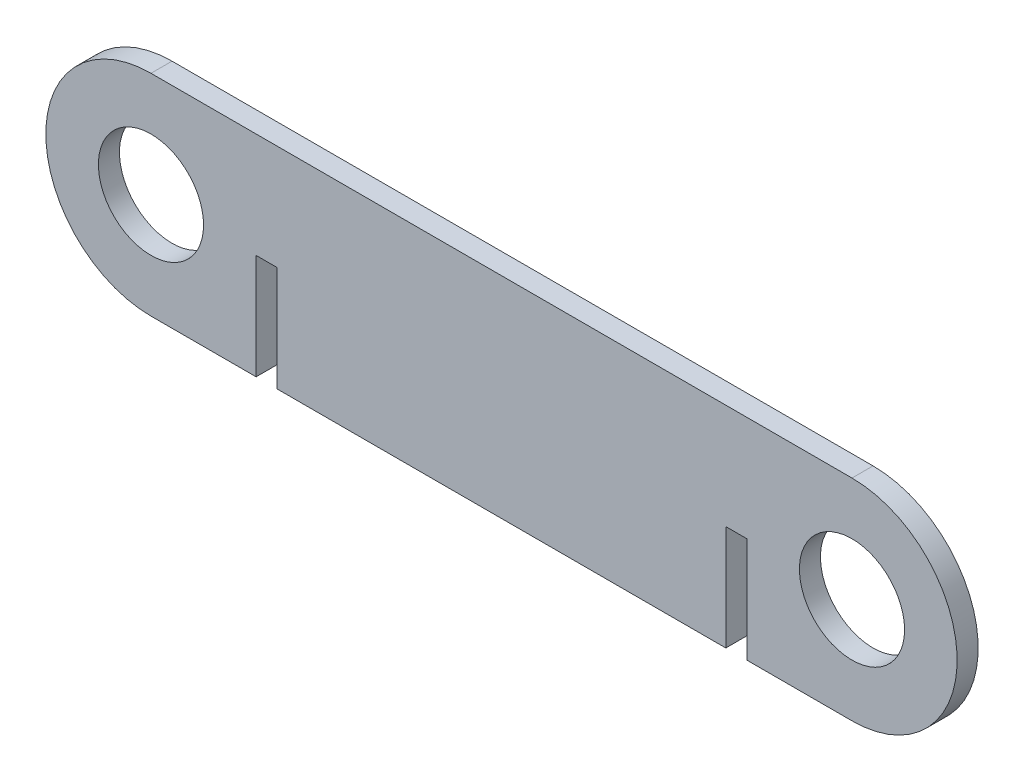
ISO-10303-21;
HEADER;
FILE_DESCRIPTION(('STEP AP214'),'2;1');
FILE_NAME('part.step','',(''),(''),'','','');
FILE_SCHEMA(('AUTOMOTIVE_DESIGN { 1 0 10303 214 1 1 1 1 }'));
ENDSEC;
DATA;
#1=APPLICATION_CONTEXT('core data for automotive mechanical design processes');
#2=APPLICATION_PROTOCOL_DEFINITION('international standard','automotive_design',2000,#1);
#3=PRODUCT_CONTEXT('',#1,'mechanical');
#4=PRODUCT('Part','Part','',(#3));
#5=PRODUCT_RELATED_PRODUCT_CATEGORY('part','',(#4));
#6=PRODUCT_DEFINITION_FORMATION('','',#4);
#7=PRODUCT_DEFINITION_CONTEXT('part definition',#1,'design');
#8=PRODUCT_DEFINITION('design','',#6,#7);
#9=PRODUCT_DEFINITION_SHAPE('','',#8);
#10=(LENGTH_UNIT() NAMED_UNIT(*) SI_UNIT(.MILLI.,.METRE.));
#11=(NAMED_UNIT(*) PLANE_ANGLE_UNIT() SI_UNIT($,.RADIAN.));
#12=(NAMED_UNIT(*) SI_UNIT($,.STERADIAN.) SOLID_ANGLE_UNIT());
#13=UNCERTAINTY_MEASURE_WITH_UNIT(LENGTH_MEASURE(1.E-05),#10,'distance_accuracy_value','');
#14=(GEOMETRIC_REPRESENTATION_CONTEXT(3) GLOBAL_UNCERTAINTY_ASSIGNED_CONTEXT((#13)) GLOBAL_UNIT_ASSIGNED_CONTEXT((#10,
#11,#12)) REPRESENTATION_CONTEXT('',''));
#15=CARTESIAN_POINT('',(0.,0.,0.));
#16=DIRECTION('',(0.,0.,1.));
#17=DIRECTION('',(1.,0.,0.));
#18=AXIS2_PLACEMENT_3D('',#15,#16,#17);
#19=CARTESIAN_POINT('',(10.4552456454755,-0.88545064021027,3.));
#20=DIRECTION('',(0.,1.,0.));
#21=DIRECTION('',(0.,0.,1.));
#22=AXIS2_PLACEMENT_3D('',#19,#20,#21);
#23=PLANE('',#22);
#24=DIRECTION('',(1.,0.,0.));
#25=VECTOR('',#24,1.);
#26=CARTESIAN_POINT('',(10.4552456454755,-0.88545064021027,0.));
#27=LINE('',#26,#25);
#28=CARTESIAN_POINT('',(28.4552456454755,-0.88545064021027,0.));
#29=VERTEX_POINT('',#28);
#30=CARTESIAN_POINT('',(92.4552456454755,-0.88545064021027,0.));
#31=VERTEX_POINT('',#30);
#32=EDGE_CURVE('E143',#29,#31,#27,.T.);
#33=ORIENTED_EDGE('',*,*,#32,.T.);
#34=DIRECTION('',(0.,0.,1.));
#35=VECTOR('',#34,1.);
#36=CARTESIAN_POINT('',(92.4552456454755,-0.88545064021027,0.));
#37=LINE('',#36,#35);
#38=CARTESIAN_POINT('',(92.4552456454755,-0.88545064021027,3.));
#39=VERTEX_POINT('',#38);
#40=EDGE_CURVE('E197',#31,#39,#37,.T.);
#41=ORIENTED_EDGE('',*,*,#40,.T.);
#42=DIRECTION('',(1.,0.,0.));
#43=VECTOR('',#42,1.);
#44=CARTESIAN_POINT('',(10.4552456454755,-0.88545064021027,3.));
#45=LINE('',#44,#43);
#46=CARTESIAN_POINT('',(28.4552456454755,-0.88545064021027,3.));
#47=VERTEX_POINT('',#46);
#48=EDGE_CURVE('E176',#47,#39,#45,.T.);
#49=ORIENTED_EDGE('',*,*,#48,.F.);
#50=DIRECTION('',(0.,0.,1.));
#51=VECTOR('',#50,1.);
#52=CARTESIAN_POINT('',(28.4552456454755,-0.88545064021027,0.));
#53=LINE('',#52,#51);
#54=EDGE_CURVE('E183',#29,#47,#53,.T.);
#55=ORIENTED_EDGE('',*,*,#54,.F.);
#56=EDGE_LOOP('',(#33,#41,#49,#55));
#57=FACE_BOUND('',#56,.T.);
#58=ADVANCED_FACE('F31',(#57),#23,.F.);
#59=CARTESIAN_POINT('',(10.4552456454755,-0.88545064021027,0.));
#60=VERTEX_POINT('',#59);
#61=CARTESIAN_POINT('',(25.4552456454755,-0.88545064021027,0.));
#62=VERTEX_POINT('',#61);
#63=EDGE_CURVE('E146',#60,#62,#27,.T.);
#64=ORIENTED_EDGE('',*,*,#63,.T.);
#65=DIRECTION('',(0.,0.,1.));
#66=VECTOR('',#65,1.);
#67=CARTESIAN_POINT('',(25.4552456454755,-0.88545064021027,0.));
#68=LINE('',#67,#66);
#69=CARTESIAN_POINT('',(25.4552456454755,-0.88545064021027,3.));
#70=VERTEX_POINT('',#69);
#71=EDGE_CURVE('E181',#62,#70,#68,.T.);
#72=ORIENTED_EDGE('',*,*,#71,.T.);
#73=CARTESIAN_POINT('',(10.4552456454755,-0.88545064021027,3.));
#74=VERTEX_POINT('',#73);
#75=EDGE_CURVE('E172',#74,#70,#45,.T.);
#76=ORIENTED_EDGE('',*,*,#75,.F.);
#77=DIRECTION('',(0.,0.,-1.));
#78=VECTOR('',#77,1.);
#79=CARTESIAN_POINT('',(10.4552456454755,-0.88545064021027,3.));
#80=LINE('',#79,#78);
#81=EDGE_CURVE('E11',#74,#60,#80,.T.);
#82=ORIENTED_EDGE('',*,*,#81,.T.);
#83=EDGE_LOOP('',(#64,#72,#76,#82));
#84=FACE_BOUND('',#83,.T.);
#85=ADVANCED_FACE('F265',(#84),#23,.F.);
#86=CARTESIAN_POINT('',(10.4552456454755,14.1145493597897,3.));
#87=DIRECTION('',(0.,0.,-1.));
#88=DIRECTION('',(-1.,0.,0.));
#89=AXIS2_PLACEMENT_3D('',#86,#87,#88);
#90=CYLINDRICAL_SURFACE('',#89,15.);
#91=CARTESIAN_POINT('',(10.4552456454755,14.1145493597897,0.));
#92=DIRECTION('',(0.,0.,1.));
#93=DIRECTION('',(1.,0.,0.));
#94=AXIS2_PLACEMENT_3D('',#91,#92,#93);
#95=CIRCLE('',#94,15.);
#96=CARTESIAN_POINT('',(10.4552456454755,29.1145493597897,0.));
#97=VERTEX_POINT('',#96);
#98=EDGE_CURVE('E144',#97,#60,#95,.T.);
#99=ORIENTED_EDGE('',*,*,#98,.T.);
#100=ORIENTED_EDGE('',*,*,#81,.F.);
#101=CARTESIAN_POINT('',(10.4552456454755,14.1145493597897,3.));
#102=DIRECTION('',(0.,0.,1.));
#103=DIRECTION('',(1.,0.,0.));
#104=AXIS2_PLACEMENT_3D('',#101,#102,#103);
#105=CIRCLE('',#104,15.);
#106=CARTESIAN_POINT('',(10.4552456454755,29.1145493597897,3.));
#107=VERTEX_POINT('',#106);
#108=EDGE_CURVE('E159',#107,#74,#105,.T.);
#109=ORIENTED_EDGE('',*,*,#108,.F.);
#110=DIRECTION('',(0.,0.,-1.));
#111=VECTOR('',#110,1.);
#112=CARTESIAN_POINT('',(10.4552456454755,29.1145493597897,3.));
#113=LINE('',#112,#111);
#114=EDGE_CURVE('E162',#107,#97,#113,.T.);
#115=ORIENTED_EDGE('',*,*,#114,.T.);
#116=EDGE_LOOP('',(#99,#100,#109,#115));
#117=FACE_BOUND('',#116,.T.);
#118=ADVANCED_FACE('F33',(#117),#90,.T.);
#119=CARTESIAN_POINT('',(95.4552456454755,-0.88545064021027,3.));
#120=VERTEX_POINT('',#119);
#121=CARTESIAN_POINT('',(110.455245645476,-0.885450640210271,3.));
#122=VERTEX_POINT('',#121);
#123=EDGE_CURVE('E136',#120,#122,#45,.T.);
#124=ORIENTED_EDGE('',*,*,#123,.F.);
#125=DIRECTION('',(0.,0.,1.));
#126=VECTOR('',#125,1.);
#127=CARTESIAN_POINT('',(95.4552456454755,-0.88545064021027,0.));
#128=LINE('',#127,#126);
#129=CARTESIAN_POINT('',(95.4552456454755,-0.88545064021027,0.));
#130=VERTEX_POINT('',#129);
#131=EDGE_CURVE('E123',#130,#120,#128,.T.);
#132=ORIENTED_EDGE('',*,*,#131,.F.);
#133=CARTESIAN_POINT('',(110.455245645476,-0.885450640210271,0.));
#134=VERTEX_POINT('',#133);
#135=EDGE_CURVE('E134',#130,#134,#27,.T.);
#136=ORIENTED_EDGE('',*,*,#135,.T.);
#137=DIRECTION('',(0.,0.,-1.));
#138=VECTOR('',#137,1.);
#139=CARTESIAN_POINT('',(110.455245645476,-0.885450640210271,3.));
#140=LINE('',#139,#138);
#141=EDGE_CURVE('E39',#122,#134,#140,.T.);
#142=ORIENTED_EDGE('',*,*,#141,.F.);
#143=EDGE_LOOP('',(#124,#132,#136,#142));
#144=FACE_BOUND('',#143,.T.);
#145=ADVANCED_FACE('F132',(#144),#23,.F.);
#146=CARTESIAN_POINT('',(110.455245645476,14.1145493597897,3.));
#147=DIRECTION('',(0.,0.,-1.));
#148=DIRECTION('',(-1.,0.,0.));
#149=AXIS2_PLACEMENT_3D('',#146,#147,#148);
#150=CYLINDRICAL_SURFACE('',#149,15.);
#151=CARTESIAN_POINT('',(110.455245645476,14.1145493597897,0.));
#152=DIRECTION('',(0.,0.,1.));
#153=DIRECTION('',(1.,0.,0.));
#154=AXIS2_PLACEMENT_3D('',#151,#152,#153);
#155=CIRCLE('',#154,15.);
#156=CARTESIAN_POINT('',(110.455245645476,29.1145493597897,0.));
#157=VERTEX_POINT('',#156);
#158=EDGE_CURVE('E142',#134,#157,#155,.T.);
#159=ORIENTED_EDGE('',*,*,#158,.T.);
#160=DIRECTION('',(0.,0.,-1.));
#161=VECTOR('',#160,1.);
#162=CARTESIAN_POINT('',(110.455245645476,29.1145493597897,3.));
#163=LINE('',#162,#161);
#164=CARTESIAN_POINT('',(110.455245645476,29.1145493597897,3.));
#165=VERTEX_POINT('',#164);
#166=EDGE_CURVE('E165',#165,#157,#163,.T.);
#167=ORIENTED_EDGE('',*,*,#166,.F.);
#168=CARTESIAN_POINT('',(110.455245645476,14.1145493597897,3.));
#169=DIRECTION('',(0.,0.,1.));
#170=DIRECTION('',(1.,0.,0.));
#171=AXIS2_PLACEMENT_3D('',#168,#169,#170);
#172=CIRCLE('',#171,15.);
#173=EDGE_CURVE('E169',#122,#165,#172,.T.);
#174=ORIENTED_EDGE('',*,*,#173,.F.);
#175=ORIENTED_EDGE('',*,*,#141,.T.);
#176=EDGE_LOOP('',(#159,#167,#174,#175));
#177=FACE_BOUND('',#176,.T.);
#178=ADVANCED_FACE('F168',(#177),#150,.T.);
#179=CARTESIAN_POINT('',(10.4552456454755,29.1145493597897,3.));
#180=DIRECTION('',(0.,-1.,0.));
#181=DIRECTION('',(0.,0.,-1.));
#182=AXIS2_PLACEMENT_3D('',#179,#180,#181);
#183=PLANE('',#182);
#184=DIRECTION('',(-1.,0.,0.));
#185=VECTOR('',#184,1.);
#186=CARTESIAN_POINT('',(10.4552456454755,29.1145493597897,0.));
#187=LINE('',#186,#185);
#188=EDGE_CURVE('E155',#157,#97,#187,.T.);
#189=ORIENTED_EDGE('',*,*,#188,.T.);
#190=ORIENTED_EDGE('',*,*,#114,.F.);
#191=DIRECTION('',(-1.,0.,0.));
#192=VECTOR('',#191,1.);
#193=CARTESIAN_POINT('',(10.4552456454755,29.1145493597897,3.));
#194=LINE('',#193,#192);
#195=EDGE_CURVE('E166',#165,#107,#194,.T.);
#196=ORIENTED_EDGE('',*,*,#195,.F.);
#197=ORIENTED_EDGE('',*,*,#166,.T.);
#198=EDGE_LOOP('',(#189,#190,#196,#197));
#199=FACE_BOUND('',#198,.T.);
#200=ADVANCED_FACE('F243',(#199),#183,.F.);
#201=CARTESIAN_POINT('',(10.4552456454755,14.1145493597897,3.));
#202=DIRECTION('',(0.,0.,1.));
#203=DIRECTION('',(1.,0.,0.));
#204=AXIS2_PLACEMENT_3D('',#201,#202,#203);
#205=PLANE('',#204);
#206=CARTESIAN_POINT('',(110.455245645476,14.1145493597897,3.));
#207=DIRECTION('',(0.,0.,1.));
#208=DIRECTION('',(1.,0.,0.));
#209=AXIS2_PLACEMENT_3D('',#206,#207,#208);
#210=CIRCLE('',#209,7.50000000000001);
#211=CARTESIAN_POINT('',(117.955245645476,14.1145493597897,3.));
#212=VERTEX_POINT('',#211);
#213=EDGE_CURVE('E225',#212,#212,#210,.T.);
#214=ORIENTED_EDGE('',*,*,#213,.F.);
#215=EDGE_LOOP('',(#214));
#216=FACE_BOUND('',#215,.T.);
#217=CARTESIAN_POINT('',(10.4552456454755,14.1145493597897,3.));
#218=DIRECTION('',(0.,0.,1.));
#219=DIRECTION('',(1.,0.,0.));
#220=AXIS2_PLACEMENT_3D('',#217,#218,#219);
#221=CIRCLE('',#220,7.5);
#222=CARTESIAN_POINT('',(17.9552456454755,14.1145493597897,3.));
#223=VERTEX_POINT('',#222);
#224=EDGE_CURVE('E219',#223,#223,#221,.T.);
#225=ORIENTED_EDGE('',*,*,#224,.F.);
#226=EDGE_LOOP('',(#225));
#227=FACE_BOUND('',#226,.T.);
#228=DIRECTION('',(0.,-1.,0.));
#229=VECTOR('',#228,1.);
#230=CARTESIAN_POINT('',(92.4552456454755,-0.88545064021027,3.));
#231=LINE('',#230,#229);
#232=CARTESIAN_POINT('',(92.4552456454755,14.1145493597897,3.));
#233=VERTEX_POINT('',#232);
#234=EDGE_CURVE('E128',#233,#39,#231,.T.);
#235=ORIENTED_EDGE('',*,*,#234,.F.);
#236=DIRECTION('',(-1.,0.,0.));
#237=VECTOR('',#236,1.);
#238=CARTESIAN_POINT('',(95.4552456454755,14.1145493597897,3.));
#239=LINE('',#238,#237);
#240=CARTESIAN_POINT('',(95.4552456454755,14.1145493597897,3.));
#241=VERTEX_POINT('',#240);
#242=EDGE_CURVE('E210',#241,#233,#239,.T.);
#243=ORIENTED_EDGE('',*,*,#242,.F.);
#244=DIRECTION('',(0.,1.,0.));
#245=VECTOR('',#244,1.);
#246=CARTESIAN_POINT('',(95.4552456454755,-0.88545064021027,3.));
#247=LINE('',#246,#245);
#248=EDGE_CURVE('E213',#120,#241,#247,.T.);
#249=ORIENTED_EDGE('',*,*,#248,.F.);
#250=ORIENTED_EDGE('',*,*,#123,.T.);
#251=ORIENTED_EDGE('',*,*,#173,.T.);
#252=ORIENTED_EDGE('',*,*,#195,.T.);
#253=ORIENTED_EDGE('',*,*,#108,.T.);
#254=ORIENTED_EDGE('',*,*,#75,.T.);
#255=DIRECTION('',(0.,-1.,0.));
#256=VECTOR('',#255,1.);
#257=CARTESIAN_POINT('',(25.4552456454755,-0.88545064021027,3.));
#258=LINE('',#257,#256);
#259=CARTESIAN_POINT('',(25.4552456454755,14.1145493597897,3.));
#260=VERTEX_POINT('',#259);
#261=EDGE_CURVE('E195',#260,#70,#258,.T.);
#262=ORIENTED_EDGE('',*,*,#261,.F.);
#263=DIRECTION('',(-1.,0.,0.));
#264=VECTOR('',#263,1.);
#265=CARTESIAN_POINT('',(25.4552456454755,14.1145493597897,3.));
#266=LINE('',#265,#264);
#267=CARTESIAN_POINT('',(28.4552456454755,14.1145493597897,3.));
#268=VERTEX_POINT('',#267);
#269=EDGE_CURVE('E188',#268,#260,#266,.T.);
#270=ORIENTED_EDGE('',*,*,#269,.F.);
#271=DIRECTION('',(0.,1.,0.));
#272=VECTOR('',#271,1.);
#273=CARTESIAN_POINT('',(28.4552456454755,-0.88545064021027,3.));
#274=LINE('',#273,#272);
#275=EDGE_CURVE('E192',#47,#268,#274,.T.);
#276=ORIENTED_EDGE('',*,*,#275,.F.);
#277=ORIENTED_EDGE('',*,*,#48,.T.);
#278=EDGE_LOOP('',(#235,#243,#249,#250,#251,#252,#253,#254,#262,#270,#276,#277));
#279=FACE_BOUND('',#278,.T.);
#280=ADVANCED_FACE('F240',(#216,#227,#279),#205,.T.);
#281=CARTESIAN_POINT('',(10.4552456454755,14.1145493597897,0.));
#282=DIRECTION('',(0.,0.,1.));
#283=DIRECTION('',(1.,0.,0.));
#284=AXIS2_PLACEMENT_3D('',#281,#282,#283);
#285=PLANE('',#284);
#286=CARTESIAN_POINT('',(110.455245645476,14.1145493597897,0.));
#287=DIRECTION('',(0.,0.,1.));
#288=DIRECTION('',(1.,0.,0.));
#289=AXIS2_PLACEMENT_3D('',#286,#287,#288);
#290=CIRCLE('',#289,7.50000000000001);
#291=CARTESIAN_POINT('',(117.955245645476,14.1145493597897,0.));
#292=VERTEX_POINT('',#291);
#293=EDGE_CURVE('E222',#292,#292,#290,.T.);
#294=ORIENTED_EDGE('',*,*,#293,.T.);
#295=EDGE_LOOP('',(#294));
#296=FACE_BOUND('',#295,.T.);
#297=CARTESIAN_POINT('',(10.4552456454755,14.1145493597897,0.));
#298=DIRECTION('',(0.,0.,1.));
#299=DIRECTION('',(1.,0.,0.));
#300=AXIS2_PLACEMENT_3D('',#297,#298,#299);
#301=CIRCLE('',#300,7.5);
#302=CARTESIAN_POINT('',(17.9552456454755,14.1145493597897,0.));
#303=VERTEX_POINT('',#302);
#304=EDGE_CURVE('E215',#303,#303,#301,.T.);
#305=ORIENTED_EDGE('',*,*,#304,.T.);
#306=EDGE_LOOP('',(#305));
#307=FACE_BOUND('',#306,.T.);
#308=DIRECTION('',(-1.,0.,0.));
#309=VECTOR('',#308,1.);
#310=CARTESIAN_POINT('',(95.4552456454755,14.1145493597897,0.));
#311=LINE('',#310,#309);
#312=CARTESIAN_POINT('',(95.4552456454755,14.1145493597897,0.));
#313=VERTEX_POINT('',#312);
#314=CARTESIAN_POINT('',(92.4552456454755,14.1145493597897,0.));
#315=VERTEX_POINT('',#314);
#316=EDGE_CURVE('E46',#313,#315,#311,.T.);
#317=ORIENTED_EDGE('',*,*,#316,.T.);
#318=DIRECTION('',(0.,-1.,0.));
#319=VECTOR('',#318,1.);
#320=CARTESIAN_POINT('',(92.4552456454755,-0.88545064021027,0.));
#321=LINE('',#320,#319);
#322=EDGE_CURVE('E137',#315,#31,#321,.T.);
#323=ORIENTED_EDGE('',*,*,#322,.T.);
#324=ORIENTED_EDGE('',*,*,#32,.F.);
#325=DIRECTION('',(0.,1.,0.));
#326=VECTOR('',#325,1.);
#327=CARTESIAN_POINT('',(28.4552456454755,-0.88545064021027,0.));
#328=LINE('',#327,#326);
#329=CARTESIAN_POINT('',(28.4552456454755,14.1145493597897,0.));
#330=VERTEX_POINT('',#329);
#331=EDGE_CURVE('E199',#29,#330,#328,.T.);
#332=ORIENTED_EDGE('',*,*,#331,.T.);
#333=DIRECTION('',(-1.,0.,0.));
#334=VECTOR('',#333,1.);
#335=CARTESIAN_POINT('',(25.4552456454755,14.1145493597897,0.));
#336=LINE('',#335,#334);
#337=CARTESIAN_POINT('',(25.4552456454755,14.1145493597897,0.));
#338=VERTEX_POINT('',#337);
#339=EDGE_CURVE('E54',#330,#338,#336,.T.);
#340=ORIENTED_EDGE('',*,*,#339,.T.);
#341=DIRECTION('',(0.,-1.,0.));
#342=VECTOR('',#341,1.);
#343=CARTESIAN_POINT('',(25.4552456454755,-0.88545064021027,0.));
#344=LINE('',#343,#342);
#345=EDGE_CURVE('E191',#338,#62,#344,.T.);
#346=ORIENTED_EDGE('',*,*,#345,.T.);
#347=ORIENTED_EDGE('',*,*,#63,.F.);
#348=ORIENTED_EDGE('',*,*,#98,.F.);
#349=ORIENTED_EDGE('',*,*,#188,.F.);
#350=ORIENTED_EDGE('',*,*,#158,.F.);
#351=ORIENTED_EDGE('',*,*,#135,.F.);
#352=DIRECTION('',(0.,1.,0.));
#353=VECTOR('',#352,1.);
#354=CARTESIAN_POINT('',(95.4552456454755,-0.88545064021027,0.));
#355=LINE('',#354,#353);
#356=EDGE_CURVE('E119',#130,#313,#355,.T.);
#357=ORIENTED_EDGE('',*,*,#356,.T.);
#358=EDGE_LOOP('',(#317,#323,#324,#332,#340,#346,#347,#348,#349,#350,#351,#357));
#359=FACE_BOUND('',#358,.T.);
#360=ADVANCED_FACE('F140',(#296,#307,#359),#285,.F.);
#361=CARTESIAN_POINT('',(25.4552456454755,-0.88545064021027,0.));
#362=DIRECTION('',(-1.,0.,0.));
#363=DIRECTION('',(0.,0.,1.));
#364=AXIS2_PLACEMENT_3D('',#361,#362,#363);
#365=PLANE('',#364);
#366=ORIENTED_EDGE('',*,*,#261,.T.);
#367=ORIENTED_EDGE('',*,*,#71,.F.);
#368=ORIENTED_EDGE('',*,*,#345,.F.);
#369=DIRECTION('',(0.,0.,1.));
#370=VECTOR('',#369,1.);
#371=CARTESIAN_POINT('',(25.4552456454755,14.1145493597897,0.));
#372=LINE('',#371,#370);
#373=EDGE_CURVE('E149',#338,#260,#372,.T.);
#374=ORIENTED_EDGE('',*,*,#373,.T.);
#375=EDGE_LOOP('',(#366,#367,#368,#374));
#376=FACE_BOUND('',#375,.T.);
#377=ADVANCED_FACE('F264',(#376),#365,.F.);
#378=CARTESIAN_POINT('',(25.4552456454755,14.1145493597897,0.));
#379=DIRECTION('',(0.,1.,0.));
#380=DIRECTION('',(0.,0.,1.));
#381=AXIS2_PLACEMENT_3D('',#378,#379,#380);
#382=PLANE('',#381);
#383=ORIENTED_EDGE('',*,*,#269,.T.);
#384=ORIENTED_EDGE('',*,*,#373,.F.);
#385=ORIENTED_EDGE('',*,*,#339,.F.);
#386=DIRECTION('',(0.,0.,1.));
#387=VECTOR('',#386,1.);
#388=CARTESIAN_POINT('',(28.4552456454755,14.1145493597897,0.));
#389=LINE('',#388,#387);
#390=EDGE_CURVE('E185',#330,#268,#389,.T.);
#391=ORIENTED_EDGE('',*,*,#390,.T.);
#392=EDGE_LOOP('',(#383,#384,#385,#391));
#393=FACE_BOUND('',#392,.T.);
#394=ADVANCED_FACE('F260',(#393),#382,.F.);
#395=CARTESIAN_POINT('',(28.4552456454755,-0.88545064021027,0.));
#396=DIRECTION('',(1.,0.,0.));
#397=DIRECTION('',(0.,0.,-1.));
#398=AXIS2_PLACEMENT_3D('',#395,#396,#397);
#399=PLANE('',#398);
#400=ORIENTED_EDGE('',*,*,#275,.T.);
#401=ORIENTED_EDGE('',*,*,#390,.F.);
#402=ORIENTED_EDGE('',*,*,#331,.F.);
#403=ORIENTED_EDGE('',*,*,#54,.T.);
#404=EDGE_LOOP('',(#400,#401,#402,#403));
#405=FACE_BOUND('',#404,.T.);
#406=ADVANCED_FACE('F258',(#405),#399,.F.);
#407=CARTESIAN_POINT('',(92.4552456454755,-0.88545064021027,0.));
#408=DIRECTION('',(-1.,0.,0.));
#409=DIRECTION('',(0.,0.,1.));
#410=AXIS2_PLACEMENT_3D('',#407,#408,#409);
#411=PLANE('',#410);
#412=ORIENTED_EDGE('',*,*,#234,.T.);
#413=ORIENTED_EDGE('',*,*,#40,.F.);
#414=ORIENTED_EDGE('',*,*,#322,.F.);
#415=DIRECTION('',(0.,0.,1.));
#416=VECTOR('',#415,1.);
#417=CARTESIAN_POINT('',(92.4552456454755,14.1145493597897,0.));
#418=LINE('',#417,#416);
#419=EDGE_CURVE('E205',#315,#233,#418,.T.);
#420=ORIENTED_EDGE('',*,*,#419,.T.);
#421=EDGE_LOOP('',(#412,#413,#414,#420));
#422=FACE_BOUND('',#421,.T.);
#423=ADVANCED_FACE('F252',(#422),#411,.F.);
#424=CARTESIAN_POINT('',(95.4552456454755,14.1145493597897,0.));
#425=DIRECTION('',(0.,1.,0.));
#426=DIRECTION('',(0.,0.,1.));
#427=AXIS2_PLACEMENT_3D('',#424,#425,#426);
#428=PLANE('',#427);
#429=ORIENTED_EDGE('',*,*,#242,.T.);
#430=ORIENTED_EDGE('',*,*,#419,.F.);
#431=ORIENTED_EDGE('',*,*,#316,.F.);
#432=DIRECTION('',(0.,0.,1.));
#433=VECTOR('',#432,1.);
#434=CARTESIAN_POINT('',(95.4552456454755,14.1145493597897,0.));
#435=LINE('',#434,#433);
#436=EDGE_CURVE('E125',#313,#241,#435,.T.);
#437=ORIENTED_EDGE('',*,*,#436,.T.);
#438=EDGE_LOOP('',(#429,#430,#431,#437));
#439=FACE_BOUND('',#438,.T.);
#440=ADVANCED_FACE('F336',(#439),#428,.F.);
#441=CARTESIAN_POINT('',(95.4552456454755,-0.88545064021027,0.));
#442=DIRECTION('',(1.,0.,0.));
#443=DIRECTION('',(0.,0.,-1.));
#444=AXIS2_PLACEMENT_3D('',#441,#442,#443);
#445=PLANE('',#444);
#446=ORIENTED_EDGE('',*,*,#248,.T.);
#447=ORIENTED_EDGE('',*,*,#436,.F.);
#448=ORIENTED_EDGE('',*,*,#356,.F.);
#449=ORIENTED_EDGE('',*,*,#131,.T.);
#450=EDGE_LOOP('',(#446,#447,#448,#449));
#451=FACE_BOUND('',#450,.T.);
#452=ADVANCED_FACE('F122',(#451),#445,.F.);
#453=CARTESIAN_POINT('',(10.4552456454755,14.1145493597897,0.));
#454=DIRECTION('',(0.,0.,1.));
#455=DIRECTION('',(1.,0.,0.));
#456=AXIS2_PLACEMENT_3D('',#453,#454,#455);
#457=CYLINDRICAL_SURFACE('',#456,7.5);
#458=ORIENTED_EDGE('',*,*,#304,.F.);
#459=EDGE_LOOP('',(#458));
#460=FACE_BOUND('',#459,.T.);
#461=ORIENTED_EDGE('',*,*,#224,.T.);
#462=EDGE_LOOP('',(#461));
#463=FACE_BOUND('',#462,.T.);
#464=ADVANCED_FACE('F236',(#460,#463),#457,.F.);
#465=CARTESIAN_POINT('',(110.455245645476,14.1145493597897,0.));
#466=DIRECTION('',(0.,0.,1.));
#467=DIRECTION('',(1.,0.,0.));
#468=AXIS2_PLACEMENT_3D('',#465,#466,#467);
#469=CYLINDRICAL_SURFACE('',#468,7.50000000000001);
#470=ORIENTED_EDGE('',*,*,#293,.F.);
#471=EDGE_LOOP('',(#470));
#472=FACE_BOUND('',#471,.T.);
#473=ORIENTED_EDGE('',*,*,#213,.T.);
#474=EDGE_LOOP('',(#473));
#475=FACE_BOUND('',#474,.T.);
#476=ADVANCED_FACE('F233',(#472,#475),#469,.F.);
#477=CLOSED_SHELL('',(#58,#85,#118,#145,#178,#200,#280,#360,#377,#394,#406,#423,#440,#452,#464,#476));
#478=MANIFOLD_SOLID_BREP('B2',#477);
#479=ADVANCED_BREP_SHAPE_REPRESENTATION('',(#18,#478),#14);
#480=SHAPE_DEFINITION_REPRESENTATION(#9,#479);
ENDSEC;
END-ISO-10303-21;
